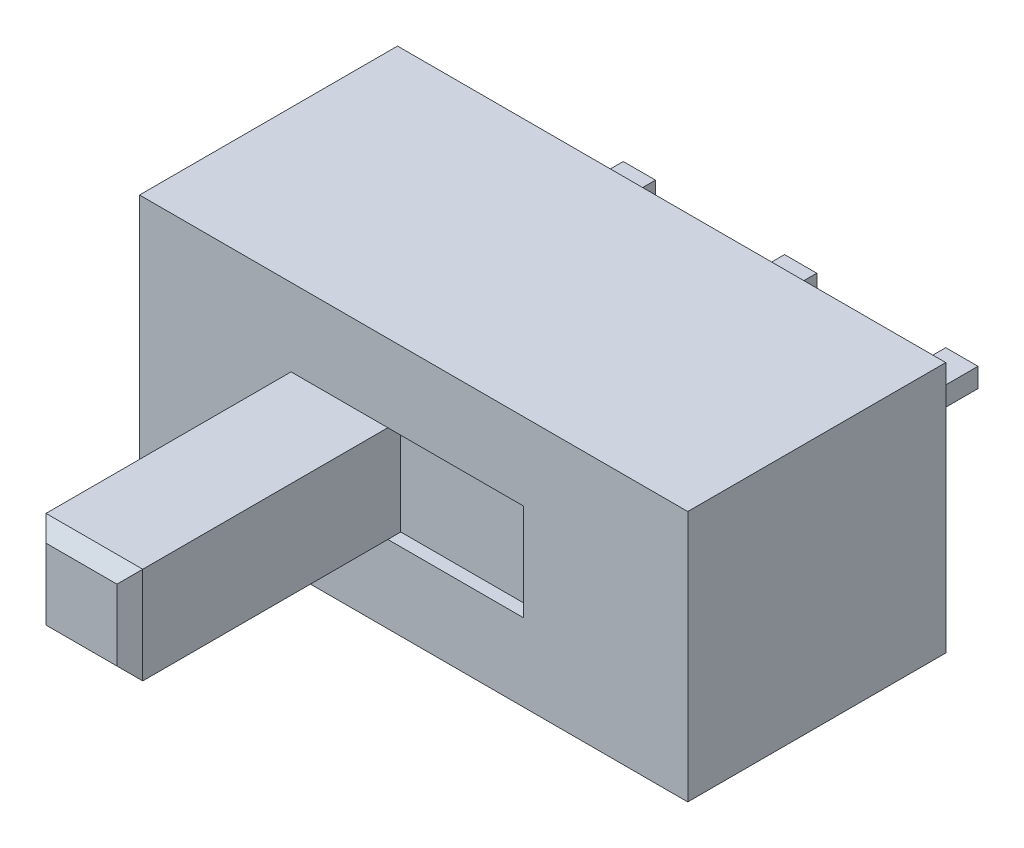
ISO-10303-21;
HEADER;
FILE_DESCRIPTION(('STEP AP214'),'2;1');
FILE_NAME('part.step','',(''),(''),'','','');
FILE_SCHEMA(('AUTOMOTIVE_DESIGN { 1 0 10303 214 1 1 1 1 }'));
ENDSEC;
DATA;
#1=APPLICATION_CONTEXT('core data for automotive mechanical design processes');
#2=APPLICATION_PROTOCOL_DEFINITION('international standard','automotive_design',2000,#1);
#3=PRODUCT_CONTEXT('',#1,'mechanical');
#4=PRODUCT('Part','Part','',(#3));
#5=PRODUCT_RELATED_PRODUCT_CATEGORY('part','',(#4));
#6=PRODUCT_DEFINITION_FORMATION('','',#4);
#7=PRODUCT_DEFINITION_CONTEXT('part definition',#1,'design');
#8=PRODUCT_DEFINITION('design','',#6,#7);
#9=PRODUCT_DEFINITION_SHAPE('','',#8);
#10=(LENGTH_UNIT() NAMED_UNIT(*) SI_UNIT(.MILLI.,.METRE.));
#11=(NAMED_UNIT(*) PLANE_ANGLE_UNIT() SI_UNIT($,.RADIAN.));
#12=(NAMED_UNIT(*) SI_UNIT($,.STERADIAN.) SOLID_ANGLE_UNIT());
#13=UNCERTAINTY_MEASURE_WITH_UNIT(LENGTH_MEASURE(1.E-05),#10,'distance_accuracy_value','');
#14=(GEOMETRIC_REPRESENTATION_CONTEXT(3) GLOBAL_UNCERTAINTY_ASSIGNED_CONTEXT((#13)) GLOBAL_UNIT_ASSIGNED_CONTEXT((#10,
#11,#12)) REPRESENTATION_CONTEXT('',''));
#15=CARTESIAN_POINT('',(0.,0.,0.));
#16=DIRECTION('',(0.,0.,1.));
#17=DIRECTION('',(1.,0.,0.));
#18=AXIS2_PLACEMENT_3D('',#15,#16,#17);
#19=CARTESIAN_POINT('',(0.,0.,0.));
#20=DIRECTION('',(0.,0.,1.));
#21=DIRECTION('',(1.,0.,0.));
#22=AXIS2_PLACEMENT_3D('',#19,#20,#21);
#23=PLANE('',#22);
#24=DIRECTION('',(0.,-1.,0.));
#25=VECTOR('',#24,1.);
#26=CARTESIAN_POINT('',(-2.25,0.15,0.));
#27=LINE('',#26,#25);
#28=CARTESIAN_POINT('',(-2.25,0.15,0.));
#29=VERTEX_POINT('',#28);
#30=CARTESIAN_POINT('',(-2.25,-0.15,0.));
#31=VERTEX_POINT('',#30);
#32=EDGE_CURVE('E224',#29,#31,#27,.T.);
#33=ORIENTED_EDGE('',*,*,#32,.F.);
#34=DIRECTION('',(1.,0.,0.));
#35=VECTOR('',#34,1.);
#36=CARTESIAN_POINT('',(-2.25,0.15,0.));
#37=LINE('',#36,#35);
#38=CARTESIAN_POINT('',(-2.75,0.15,0.));
#39=VERTEX_POINT('',#38);
#40=EDGE_CURVE('E237',#39,#29,#37,.T.);
#41=ORIENTED_EDGE('',*,*,#40,.F.);
#42=DIRECTION('',(0.,1.,0.));
#43=VECTOR('',#42,1.);
#44=CARTESIAN_POINT('',(-2.75,0.15,0.));
#45=LINE('',#44,#43);
#46=CARTESIAN_POINT('',(-2.75,-0.15,0.));
#47=VERTEX_POINT('',#46);
#48=EDGE_CURVE('E246',#47,#39,#45,.T.);
#49=ORIENTED_EDGE('',*,*,#48,.F.);
#50=DIRECTION('',(-1.,0.,0.));
#51=VECTOR('',#50,1.);
#52=CARTESIAN_POINT('',(-2.25,-0.15,0.));
#53=LINE('',#52,#51);
#54=EDGE_CURVE('E227',#31,#47,#53,.T.);
#55=ORIENTED_EDGE('',*,*,#54,.F.);
#56=EDGE_LOOP('',(#33,#41,#49,#55));
#57=FACE_BOUND('',#56,.T.);
#58=DIRECTION('',(0.,1.,0.));
#59=VECTOR('',#58,1.);
#60=CARTESIAN_POINT('',(4.25,1.95,0.));
#61=LINE('',#60,#59);
#62=CARTESIAN_POINT('',(4.25,-1.95,0.));
#63=VERTEX_POINT('',#62);
#64=CARTESIAN_POINT('',(4.25,1.95,0.));
#65=VERTEX_POINT('',#64);
#66=EDGE_CURVE('E344',#63,#65,#61,.T.);
#67=ORIENTED_EDGE('',*,*,#66,.F.);
#68=DIRECTION('',(1.,0.,0.));
#69=VECTOR('',#68,1.);
#70=CARTESIAN_POINT('',(-4.25,-1.95,0.));
#71=LINE('',#70,#69);
#72=CARTESIAN_POINT('',(-4.25,-1.95,0.));
#73=VERTEX_POINT('',#72);
#74=EDGE_CURVE('E349',#73,#63,#71,.T.);
#75=ORIENTED_EDGE('',*,*,#74,.F.);
#76=DIRECTION('',(0.,-1.,0.));
#77=VECTOR('',#76,1.);
#78=CARTESIAN_POINT('',(-4.25,1.95,0.));
#79=LINE('',#78,#77);
#80=CARTESIAN_POINT('',(-4.25,1.95,0.));
#81=VERTEX_POINT('',#80);
#82=EDGE_CURVE('E360',#81,#73,#79,.T.);
#83=ORIENTED_EDGE('',*,*,#82,.F.);
#84=DIRECTION('',(-1.,0.,0.));
#85=VECTOR('',#84,1.);
#86=CARTESIAN_POINT('',(-4.25,1.95,0.));
#87=LINE('',#86,#85);
#88=EDGE_CURVE('E358',#65,#81,#87,.T.);
#89=ORIENTED_EDGE('',*,*,#88,.F.);
#90=EDGE_LOOP('',(#67,#75,#83,#89));
#91=FACE_BOUND('',#90,.T.);
#92=DIRECTION('',(0.,1.,0.));
#93=VECTOR('',#92,1.);
#94=CARTESIAN_POINT('',(-0.25,0.15,0.));
#95=LINE('',#94,#93);
#96=CARTESIAN_POINT('',(-0.25,-0.15,0.));
#97=VERTEX_POINT('',#96);
#98=CARTESIAN_POINT('',(-0.25,0.15,0.));
#99=VERTEX_POINT('',#98);
#100=EDGE_CURVE('E262',#97,#99,#95,.T.);
#101=ORIENTED_EDGE('',*,*,#100,.F.);
#102=DIRECTION('',(-1.,0.,0.));
#103=VECTOR('',#102,1.);
#104=CARTESIAN_POINT('',(0.25,-0.15,0.));
#105=LINE('',#104,#103);
#106=CARTESIAN_POINT('',(0.25,-0.15,0.));
#107=VERTEX_POINT('',#106);
#108=EDGE_CURVE('E267',#107,#97,#105,.T.);
#109=ORIENTED_EDGE('',*,*,#108,.F.);
#110=DIRECTION('',(0.,-1.,0.));
#111=VECTOR('',#110,1.);
#112=CARTESIAN_POINT('',(0.25,0.15,0.));
#113=LINE('',#112,#111);
#114=CARTESIAN_POINT('',(0.25,0.15,0.));
#115=VERTEX_POINT('',#114);
#116=EDGE_CURVE('E279',#115,#107,#113,.T.);
#117=ORIENTED_EDGE('',*,*,#116,.F.);
#118=DIRECTION('',(1.,0.,0.));
#119=VECTOR('',#118,1.);
#120=CARTESIAN_POINT('',(0.25,0.15,0.));
#121=LINE('',#120,#119);
#122=EDGE_CURVE('E276',#99,#115,#121,.T.);
#123=ORIENTED_EDGE('',*,*,#122,.F.);
#124=EDGE_LOOP('',(#101,#109,#117,#123));
#125=FACE_BOUND('',#124,.T.);
#126=DIRECTION('',(1.,0.,0.));
#127=VECTOR('',#126,1.);
#128=CARTESIAN_POINT('',(2.25,0.15,0.));
#129=LINE('',#128,#127);
#130=CARTESIAN_POINT('',(2.25,0.15,0.));
#131=VERTEX_POINT('',#130);
#132=CARTESIAN_POINT('',(2.75,0.15,0.));
#133=VERTEX_POINT('',#132);
#134=EDGE_CURVE('E223',#131,#133,#129,.T.);
#135=ORIENTED_EDGE('',*,*,#134,.F.);
#136=DIRECTION('',(0.,1.,0.));
#137=VECTOR('',#136,1.);
#138=CARTESIAN_POINT('',(2.25,0.15,0.));
#139=LINE('',#138,#137);
#140=CARTESIAN_POINT('',(2.25,-0.15,0.));
#141=VERTEX_POINT('',#140);
#142=EDGE_CURVE('E220',#141,#131,#139,.T.);
#143=ORIENTED_EDGE('',*,*,#142,.F.);
#144=DIRECTION('',(-1.,0.,0.));
#145=VECTOR('',#144,1.);
#146=CARTESIAN_POINT('',(2.25,-0.15,0.));
#147=LINE('',#146,#145);
#148=CARTESIAN_POINT('',(2.75,-0.15,0.));
#149=VERTEX_POINT('',#148);
#150=EDGE_CURVE('E57',#149,#141,#147,.T.);
#151=ORIENTED_EDGE('',*,*,#150,.F.);
#152=DIRECTION('',(0.,-1.,0.));
#153=VECTOR('',#152,1.);
#154=CARTESIAN_POINT('',(2.75,0.15,0.));
#155=LINE('',#154,#153);
#156=EDGE_CURVE('E52',#133,#149,#155,.T.);
#157=ORIENTED_EDGE('',*,*,#156,.F.);
#158=EDGE_LOOP('',(#135,#143,#151,#157));
#159=FACE_BOUND('',#158,.T.);
#160=ADVANCED_FACE('F35',(#57,#91,#125,#159),#23,.F.);
#161=CARTESIAN_POINT('',(0.,0.,4.));
#162=DIRECTION('',(0.,0.,1.));
#163=DIRECTION('',(1.,0.,0.));
#164=AXIS2_PLACEMENT_3D('',#161,#162,#163);
#165=PLANE('',#164);
#166=DIRECTION('',(-1.,0.,0.));
#167=VECTOR('',#166,1.);
#168=CARTESIAN_POINT('',(-0.4,0.75,4.));
#169=LINE('',#168,#167);
#170=CARTESIAN_POINT('',(1.7,0.75,4.));
#171=VERTEX_POINT('',#170);
#172=CARTESIAN_POINT('',(-0.4,0.75,4.));
#173=VERTEX_POINT('',#172);
#174=EDGE_CURVE('E300',#171,#173,#169,.T.);
#175=ORIENTED_EDGE('',*,*,#174,.F.);
#176=DIRECTION('',(0.,1.,0.));
#177=VECTOR('',#176,1.);
#178=CARTESIAN_POINT('',(1.7,0.75,4.));
#179=LINE('',#178,#177);
#180=CARTESIAN_POINT('',(1.7,-0.75,4.));
#181=VERTEX_POINT('',#180);
#182=EDGE_CURVE('E312',#181,#171,#179,.T.);
#183=ORIENTED_EDGE('',*,*,#182,.F.);
#184=DIRECTION('',(1.,0.,0.));
#185=VECTOR('',#184,1.);
#186=CARTESIAN_POINT('',(-0.4,-0.75,4.));
#187=LINE('',#186,#185);
#188=CARTESIAN_POINT('',(-0.4,-0.75,4.));
#189=VERTEX_POINT('',#188);
#190=EDGE_CURVE('E295',#189,#181,#187,.T.);
#191=ORIENTED_EDGE('',*,*,#190,.F.);
#192=DIRECTION('',(1.,0.,0.));
#193=VECTOR('',#192,1.);
#194=CARTESIAN_POINT('',(-1.9,-0.75,4.));
#195=LINE('',#194,#193);
#196=CARTESIAN_POINT('',(-1.9,-0.75,4.));
#197=VERTEX_POINT('',#196);
#198=EDGE_CURVE('E331',#197,#189,#195,.T.);
#199=ORIENTED_EDGE('',*,*,#198,.F.);
#200=DIRECTION('',(0.,-1.,0.));
#201=VECTOR('',#200,1.);
#202=CARTESIAN_POINT('',(-1.9,0.75,4.));
#203=LINE('',#202,#201);
#204=CARTESIAN_POINT('',(-1.9,0.75,4.));
#205=VERTEX_POINT('',#204);
#206=EDGE_CURVE('E328',#205,#197,#203,.T.);
#207=ORIENTED_EDGE('',*,*,#206,.F.);
#208=DIRECTION('',(-1.,0.,0.));
#209=VECTOR('',#208,1.);
#210=CARTESIAN_POINT('',(-1.9,0.75,4.));
#211=LINE('',#210,#209);
#212=EDGE_CURVE('E325',#173,#205,#211,.T.);
#213=ORIENTED_EDGE('',*,*,#212,.F.);
#214=EDGE_LOOP('',(#175,#183,#191,#199,#207,#213));
#215=FACE_BOUND('',#214,.T.);
#216=DIRECTION('',(0.,1.,0.));
#217=VECTOR('',#216,1.);
#218=CARTESIAN_POINT('',(4.25,1.95,4.));
#219=LINE('',#218,#217);
#220=CARTESIAN_POINT('',(4.25,-1.95,4.));
#221=VERTEX_POINT('',#220);
#222=CARTESIAN_POINT('',(4.25,1.95,4.));
#223=VERTEX_POINT('',#222);
#224=EDGE_CURVE('E345',#221,#223,#219,.T.);
#225=ORIENTED_EDGE('',*,*,#224,.T.);
#226=DIRECTION('',(-1.,0.,0.));
#227=VECTOR('',#226,1.);
#228=CARTESIAN_POINT('',(-4.25,1.95,4.));
#229=LINE('',#228,#227);
#230=CARTESIAN_POINT('',(-4.25,1.95,4.));
#231=VERTEX_POINT('',#230);
#232=EDGE_CURVE('E348',#223,#231,#229,.T.);
#233=ORIENTED_EDGE('',*,*,#232,.T.);
#234=DIRECTION('',(0.,-1.,0.));
#235=VECTOR('',#234,1.);
#236=CARTESIAN_POINT('',(-4.25,1.95,4.));
#237=LINE('',#236,#235);
#238=CARTESIAN_POINT('',(-4.25,-1.95,4.));
#239=VERTEX_POINT('',#238);
#240=EDGE_CURVE('E351',#231,#239,#237,.T.);
#241=ORIENTED_EDGE('',*,*,#240,.T.);
#242=DIRECTION('',(1.,0.,0.));
#243=VECTOR('',#242,1.);
#244=CARTESIAN_POINT('',(-4.25,-1.95,4.));
#245=LINE('',#244,#243);
#246=EDGE_CURVE('E353',#239,#221,#245,.T.);
#247=ORIENTED_EDGE('',*,*,#246,.T.);
#248=EDGE_LOOP('',(#225,#233,#241,#247));
#249=FACE_BOUND('',#248,.T.);
#250=ADVANCED_FACE('F419',(#215,#249),#165,.T.);
#251=CARTESIAN_POINT('',(4.25,1.95,4.));
#252=DIRECTION('',(-1.,0.,0.));
#253=DIRECTION('',(0.,-1.,0.));
#254=AXIS2_PLACEMENT_3D('',#251,#252,#253);
#255=PLANE('',#254);
#256=ORIENTED_EDGE('',*,*,#66,.T.);
#257=DIRECTION('',(0.,0.,-1.));
#258=VECTOR('',#257,1.);
#259=CARTESIAN_POINT('',(4.25,1.95,4.));
#260=LINE('',#259,#258);
#261=EDGE_CURVE('E371',#223,#65,#260,.T.);
#262=ORIENTED_EDGE('',*,*,#261,.F.);
#263=ORIENTED_EDGE('',*,*,#224,.F.);
#264=DIRECTION('',(0.,0.,-1.));
#265=VECTOR('',#264,1.);
#266=CARTESIAN_POINT('',(4.25,-1.95,4.));
#267=LINE('',#266,#265);
#268=EDGE_CURVE('E355',#221,#63,#267,.T.);
#269=ORIENTED_EDGE('',*,*,#268,.T.);
#270=EDGE_LOOP('',(#256,#262,#263,#269));
#271=FACE_BOUND('',#270,.T.);
#272=ADVANCED_FACE('F452',(#271),#255,.F.);
#273=CARTESIAN_POINT('',(-4.25,1.95,4.));
#274=DIRECTION('',(0.,-1.,0.));
#275=DIRECTION('',(0.,0.,-1.));
#276=AXIS2_PLACEMENT_3D('',#273,#274,#275);
#277=PLANE('',#276);
#278=ORIENTED_EDGE('',*,*,#88,.T.);
#279=DIRECTION('',(0.,0.,-1.));
#280=VECTOR('',#279,1.);
#281=CARTESIAN_POINT('',(-4.25,1.95,4.));
#282=LINE('',#281,#280);
#283=EDGE_CURVE('E368',#231,#81,#282,.T.);
#284=ORIENTED_EDGE('',*,*,#283,.F.);
#285=ORIENTED_EDGE('',*,*,#232,.F.);
#286=ORIENTED_EDGE('',*,*,#261,.T.);
#287=EDGE_LOOP('',(#278,#284,#285,#286));
#288=FACE_BOUND('',#287,.T.);
#289=ADVANCED_FACE('F464',(#288),#277,.F.);
#290=CARTESIAN_POINT('',(-4.25,1.95,4.));
#291=DIRECTION('',(1.,0.,0.));
#292=DIRECTION('',(0.,0.,-1.));
#293=AXIS2_PLACEMENT_3D('',#290,#291,#292);
#294=PLANE('',#293);
#295=ORIENTED_EDGE('',*,*,#82,.T.);
#296=DIRECTION('',(0.,0.,-1.));
#297=VECTOR('',#296,1.);
#298=CARTESIAN_POINT('',(-4.25,-1.95,4.));
#299=LINE('',#298,#297);
#300=EDGE_CURVE('E365',#239,#73,#299,.T.);
#301=ORIENTED_EDGE('',*,*,#300,.F.);
#302=ORIENTED_EDGE('',*,*,#240,.F.);
#303=ORIENTED_EDGE('',*,*,#283,.T.);
#304=EDGE_LOOP('',(#295,#301,#302,#303));
#305=FACE_BOUND('',#304,.T.);
#306=ADVANCED_FACE('F460',(#305),#294,.F.);
#307=CARTESIAN_POINT('',(-4.25,-1.95,4.));
#308=DIRECTION('',(0.,1.,0.));
#309=DIRECTION('',(-1.,0.,0.));
#310=AXIS2_PLACEMENT_3D('',#307,#308,#309);
#311=PLANE('',#310);
#312=ORIENTED_EDGE('',*,*,#74,.T.);
#313=ORIENTED_EDGE('',*,*,#268,.F.);
#314=ORIENTED_EDGE('',*,*,#246,.F.);
#315=ORIENTED_EDGE('',*,*,#300,.T.);
#316=EDGE_LOOP('',(#312,#313,#314,#315));
#317=FACE_BOUND('',#316,.T.);
#318=ADVANCED_FACE('F457',(#317),#311,.F.);
#319=CARTESIAN_POINT('',(-0.4,0.75,8.));
#320=DIRECTION('',(-1.,0.,0.));
#321=DIRECTION('',(0.,-1.,0.));
#322=AXIS2_PLACEMENT_3D('',#319,#320,#321);
#323=PLANE('',#322);
#324=DIRECTION('',(0.,0.,-1.));
#325=VECTOR('',#324,1.);
#326=CARTESIAN_POINT('',(-0.4,0.75,8.));
#327=LINE('',#326,#325);
#328=CARTESIAN_POINT('',(-0.4,0.75,7.8));
#329=VERTEX_POINT('',#328);
#330=EDGE_CURVE('E341',#329,#173,#327,.T.);
#331=ORIENTED_EDGE('',*,*,#330,.F.);
#332=DIRECTION('',(0.,-1.,0.));
#333=VECTOR('',#332,1.);
#334=CARTESIAN_POINT('',(-0.4,-0.75,7.8));
#335=LINE('',#334,#333);
#336=CARTESIAN_POINT('',(-0.4,-0.75,7.8));
#337=VERTEX_POINT('',#336);
#338=EDGE_CURVE('E383',#329,#337,#335,.T.);
#339=ORIENTED_EDGE('',*,*,#338,.T.);
#340=DIRECTION('',(0.,0.,-1.));
#341=VECTOR('',#340,1.);
#342=CARTESIAN_POINT('',(-0.4,-0.75,8.));
#343=LINE('',#342,#341);
#344=EDGE_CURVE('E334',#337,#189,#343,.T.);
#345=ORIENTED_EDGE('',*,*,#344,.T.);
#346=DIRECTION('',(0.,0.,1.));
#347=VECTOR('',#346,1.);
#348=CARTESIAN_POINT('',(-0.4,-0.75,3.8));
#349=LINE('',#348,#347);
#350=CARTESIAN_POINT('',(-0.4,-0.75,3.8));
#351=VERTEX_POINT('',#350);
#352=EDGE_CURVE('E309',#351,#189,#349,.T.);
#353=ORIENTED_EDGE('',*,*,#352,.F.);
#354=DIRECTION('',(0.,-1.,0.));
#355=VECTOR('',#354,1.);
#356=CARTESIAN_POINT('',(-0.4,0.75,3.8));
#357=LINE('',#356,#355);
#358=CARTESIAN_POINT('',(-0.4,0.75,3.8));
#359=VERTEX_POINT('',#358);
#360=EDGE_CURVE('E296',#359,#351,#357,.T.);
#361=ORIENTED_EDGE('',*,*,#360,.F.);
#362=DIRECTION('',(0.,0.,1.));
#363=VECTOR('',#362,1.);
#364=CARTESIAN_POINT('',(-0.4,0.75,3.8));
#365=LINE('',#364,#363);
#366=EDGE_CURVE('E316',#359,#173,#365,.T.);
#367=ORIENTED_EDGE('',*,*,#366,.T.);
#368=EDGE_LOOP('',(#331,#339,#345,#353,#361,#367));
#369=FACE_BOUND('',#368,.T.);
#370=ADVANCED_FACE('F427',(#369),#323,.F.);
#371=CARTESIAN_POINT('',(-1.9,0.75,8.));
#372=DIRECTION('',(0.,-1.,0.));
#373=DIRECTION('',(0.,0.,-1.));
#374=AXIS2_PLACEMENT_3D('',#371,#372,#373);
#375=PLANE('',#374);
#376=DIRECTION('',(0.,0.,-1.));
#377=VECTOR('',#376,1.);
#378=CARTESIAN_POINT('',(-1.9,0.75,8.));
#379=LINE('',#378,#377);
#380=CARTESIAN_POINT('',(-1.9,0.75,7.8));
#381=VERTEX_POINT('',#380);
#382=EDGE_CURVE('E339',#381,#205,#379,.T.);
#383=ORIENTED_EDGE('',*,*,#382,.F.);
#384=DIRECTION('',(1.,0.,0.));
#385=VECTOR('',#384,1.);
#386=CARTESIAN_POINT('',(-0.4,0.75,7.8));
#387=LINE('',#386,#385);
#388=EDGE_CURVE('E386',#381,#329,#387,.T.);
#389=ORIENTED_EDGE('',*,*,#388,.T.);
#390=ORIENTED_EDGE('',*,*,#330,.T.);
#391=ORIENTED_EDGE('',*,*,#212,.T.);
#392=EDGE_LOOP('',(#383,#389,#390,#391));
#393=FACE_BOUND('',#392,.T.);
#394=ADVANCED_FACE('F412',(#393),#375,.F.);
#395=CARTESIAN_POINT('',(-1.9,0.75,8.));
#396=DIRECTION('',(1.,0.,0.));
#397=DIRECTION('',(0.,1.,0.));
#398=AXIS2_PLACEMENT_3D('',#395,#396,#397);
#399=PLANE('',#398);
#400=DIRECTION('',(0.,0.,-1.));
#401=VECTOR('',#400,1.);
#402=CARTESIAN_POINT('',(-1.9,-0.75,8.));
#403=LINE('',#402,#401);
#404=CARTESIAN_POINT('',(-1.9,-0.75,7.8));
#405=VERTEX_POINT('',#404);
#406=EDGE_CURVE('E337',#405,#197,#403,.T.);
#407=ORIENTED_EDGE('',*,*,#406,.F.);
#408=DIRECTION('',(0.,1.,0.));
#409=VECTOR('',#408,1.);
#410=CARTESIAN_POINT('',(-1.9,0.75,7.8));
#411=LINE('',#410,#409);
#412=EDGE_CURVE('E44',#405,#381,#411,.T.);
#413=ORIENTED_EDGE('',*,*,#412,.T.);
#414=ORIENTED_EDGE('',*,*,#382,.T.);
#415=ORIENTED_EDGE('',*,*,#206,.T.);
#416=EDGE_LOOP('',(#407,#413,#414,#415));
#417=FACE_BOUND('',#416,.T.);
#418=ADVANCED_FACE('F410',(#417),#399,.F.);
#419=CARTESIAN_POINT('',(-1.9,-0.75,8.));
#420=DIRECTION('',(0.,1.,0.));
#421=DIRECTION('',(0.,0.,1.));
#422=AXIS2_PLACEMENT_3D('',#419,#420,#421);
#423=PLANE('',#422);
#424=ORIENTED_EDGE('',*,*,#344,.F.);
#425=DIRECTION('',(-1.,0.,0.));
#426=VECTOR('',#425,1.);
#427=CARTESIAN_POINT('',(-1.9,-0.75,7.8));
#428=LINE('',#427,#426);
#429=EDGE_CURVE('E11',#337,#405,#428,.T.);
#430=ORIENTED_EDGE('',*,*,#429,.T.);
#431=ORIENTED_EDGE('',*,*,#406,.T.);
#432=ORIENTED_EDGE('',*,*,#198,.T.);
#433=EDGE_LOOP('',(#424,#430,#431,#432));
#434=FACE_BOUND('',#433,.T.);
#435=ADVANCED_FACE('F425',(#434),#423,.F.);
#436=CARTESIAN_POINT('',(0.,0.,8.));
#437=DIRECTION('',(0.,0.,1.));
#438=DIRECTION('',(1.,0.,0.));
#439=AXIS2_PLACEMENT_3D('',#436,#437,#438);
#440=PLANE('',#439);
#441=DIRECTION('',(1.,0.,0.));
#442=VECTOR('',#441,1.);
#443=CARTESIAN_POINT('',(-0.4,-0.55,8.));
#444=LINE('',#443,#442);
#445=CARTESIAN_POINT('',(-1.7,-0.55,8.));
#446=VERTEX_POINT('',#445);
#447=CARTESIAN_POINT('',(-0.6,-0.55,8.));
#448=VERTEX_POINT('',#447);
#449=EDGE_CURVE('E374',#446,#448,#444,.T.);
#450=ORIENTED_EDGE('',*,*,#449,.T.);
#451=DIRECTION('',(0.,1.,0.));
#452=VECTOR('',#451,1.);
#453=CARTESIAN_POINT('',(-0.600000000000001,0.75,8.));
#454=LINE('',#453,#452);
#455=CARTESIAN_POINT('',(-0.600000000000001,0.549999999999999,8.));
#456=VERTEX_POINT('',#455);
#457=EDGE_CURVE('E380',#448,#456,#454,.T.);
#458=ORIENTED_EDGE('',*,*,#457,.T.);
#459=DIRECTION('',(-1.,0.,0.));
#460=VECTOR('',#459,1.);
#461=CARTESIAN_POINT('',(-1.9,0.549999999999999,8.));
#462=LINE('',#461,#460);
#463=CARTESIAN_POINT('',(-1.7,0.549999999999999,8.));
#464=VERTEX_POINT('',#463);
#465=EDGE_CURVE('E378',#456,#464,#462,.T.);
#466=ORIENTED_EDGE('',*,*,#465,.T.);
#467=DIRECTION('',(0.,-1.,0.));
#468=VECTOR('',#467,1.);
#469=CARTESIAN_POINT('',(-1.7,-0.75,8.));
#470=LINE('',#469,#468);
#471=EDGE_CURVE('E376',#464,#446,#470,.T.);
#472=ORIENTED_EDGE('',*,*,#471,.T.);
#473=EDGE_LOOP('',(#450,#458,#466,#472));
#474=FACE_BOUND('',#473,.T.);
#475=ADVANCED_FACE('F437',(#474),#440,.T.);
#476=CARTESIAN_POINT('',(-1.7,0.,8.));
#477=DIRECTION('',(-0.707106781186549,0.,0.707106781186546));
#478=DIRECTION('',(0.,1.,0.));
#479=AXIS2_PLACEMENT_3D('',#476,#477,#478);
#480=PLANE('',#479);
#481=DIRECTION('',(-0.577350269189625,0.577350269189625,-0.577350269189627));
#482=VECTOR('',#481,1.);
#483=CARTESIAN_POINT('',(-1.51666666666667,0.366666666666667,8.18333333333333));
#484=LINE('',#483,#482);
#485=EDGE_CURVE('E391',#381,#464,#484,.F.);
#486=ORIENTED_EDGE('',*,*,#485,.F.);
#487=ORIENTED_EDGE('',*,*,#412,.F.);
#488=DIRECTION('',(-0.577350269189625,-0.577350269189625,-0.577350269189627));
#489=VECTOR('',#488,1.);
#490=CARTESIAN_POINT('',(-1.13333333333333,0.0166666666666652,8.56666666666667));
#491=LINE('',#490,#489);
#492=EDGE_CURVE('E39',#446,#405,#491,.T.);
#493=ORIENTED_EDGE('',*,*,#492,.F.);
#494=ORIENTED_EDGE('',*,*,#471,.F.);
#495=EDGE_LOOP('',(#486,#487,#493,#494));
#496=FACE_BOUND('',#495,.T.);
#497=ADVANCED_FACE('F37',(#496),#480,.T.);
#498=CARTESIAN_POINT('',(0.,-0.55,8.));
#499=DIRECTION('',(0.,-0.707106781186549,0.707106781186546));
#500=DIRECTION('',(-1.,0.,0.));
#501=AXIS2_PLACEMENT_3D('',#498,#499,#500);
#502=PLANE('',#501);
#503=ORIENTED_EDGE('',*,*,#492,.T.);
#504=ORIENTED_EDGE('',*,*,#429,.F.);
#505=DIRECTION('',(-0.577350269189625,0.577350269189625,0.577350269189627));
#506=VECTOR('',#505,1.);
#507=CARTESIAN_POINT('',(-0.400000000000001,-0.749999999999999,7.8));
#508=LINE('',#507,#506);
#509=EDGE_CURVE('E390',#448,#337,#508,.F.);
#510=ORIENTED_EDGE('',*,*,#509,.F.);
#511=ORIENTED_EDGE('',*,*,#449,.F.);
#512=EDGE_LOOP('',(#503,#504,#510,#511));
#513=FACE_BOUND('',#512,.T.);
#514=ADVANCED_FACE('F402',(#513),#502,.T.);
#515=CARTESIAN_POINT('',(0.,0.549999999999999,8.));
#516=DIRECTION('',(0.,0.707106781186549,0.707106781186546));
#517=DIRECTION('',(1.,0.,0.));
#518=AXIS2_PLACEMENT_3D('',#515,#516,#517);
#519=PLANE('',#518);
#520=ORIENTED_EDGE('',*,*,#485,.T.);
#521=ORIENTED_EDGE('',*,*,#465,.F.);
#522=DIRECTION('',(0.577350269189625,0.577350269189625,-0.577350269189627));
#523=VECTOR('',#522,1.);
#524=CARTESIAN_POINT('',(-0.400000000000001,0.749999999999999,7.8));
#525=LINE('',#524,#523);
#526=EDGE_CURVE('E319',#329,#456,#525,.F.);
#527=ORIENTED_EDGE('',*,*,#526,.F.);
#528=ORIENTED_EDGE('',*,*,#388,.F.);
#529=EDGE_LOOP('',(#520,#521,#527,#528));
#530=FACE_BOUND('',#529,.T.);
#531=ADVANCED_FACE('F435',(#530),#519,.T.);
#532=CARTESIAN_POINT('',(-0.6,0.,8.));
#533=DIRECTION('',(0.707106781186549,0.,0.707106781186546));
#534=DIRECTION('',(0.,-1.,0.));
#535=AXIS2_PLACEMENT_3D('',#532,#533,#534);
#536=PLANE('',#535);
#537=ORIENTED_EDGE('',*,*,#509,.T.);
#538=ORIENTED_EDGE('',*,*,#338,.F.);
#539=ORIENTED_EDGE('',*,*,#526,.T.);
#540=ORIENTED_EDGE('',*,*,#457,.F.);
#541=EDGE_LOOP('',(#537,#538,#539,#540));
#542=FACE_BOUND('',#541,.T.);
#543=ADVANCED_FACE('F433',(#542),#536,.T.);
#544=CARTESIAN_POINT('',(-0.4,0.75,3.8));
#545=DIRECTION('',(0.,1.,0.));
#546=DIRECTION('',(-1.,0.,0.));
#547=AXIS2_PLACEMENT_3D('',#544,#545,#546);
#548=PLANE('',#547);
#549=ORIENTED_EDGE('',*,*,#174,.T.);
#550=ORIENTED_EDGE('',*,*,#366,.F.);
#551=DIRECTION('',(-1.,0.,0.));
#552=VECTOR('',#551,1.);
#553=CARTESIAN_POINT('',(-0.4,0.75,3.8));
#554=LINE('',#553,#552);
#555=CARTESIAN_POINT('',(1.7,0.75,3.8));
#556=VERTEX_POINT('',#555);
#557=EDGE_CURVE('E306',#556,#359,#554,.T.);
#558=ORIENTED_EDGE('',*,*,#557,.F.);
#559=DIRECTION('',(0.,0.,1.));
#560=VECTOR('',#559,1.);
#561=CARTESIAN_POINT('',(1.7,0.75,3.8));
#562=LINE('',#561,#560);
#563=EDGE_CURVE('E320',#556,#171,#562,.T.);
#564=ORIENTED_EDGE('',*,*,#563,.T.);
#565=EDGE_LOOP('',(#549,#550,#558,#564));
#566=FACE_BOUND('',#565,.T.);
#567=ADVANCED_FACE('F474',(#566),#548,.F.);
#568=CARTESIAN_POINT('',(1.7,0.75,3.8));
#569=DIRECTION('',(1.,0.,0.));
#570=DIRECTION('',(0.,1.,0.));
#571=AXIS2_PLACEMENT_3D('',#568,#569,#570);
#572=PLANE('',#571);
#573=ORIENTED_EDGE('',*,*,#182,.T.);
#574=ORIENTED_EDGE('',*,*,#563,.F.);
#575=DIRECTION('',(0.,1.,0.));
#576=VECTOR('',#575,1.);
#577=CARTESIAN_POINT('',(1.7,0.75,3.8));
#578=LINE('',#577,#576);
#579=CARTESIAN_POINT('',(1.7,-0.75,3.8));
#580=VERTEX_POINT('',#579);
#581=EDGE_CURVE('E303',#580,#556,#578,.T.);
#582=ORIENTED_EDGE('',*,*,#581,.F.);
#583=DIRECTION('',(0.,0.,1.));
#584=VECTOR('',#583,1.);
#585=CARTESIAN_POINT('',(1.7,-0.75,3.8));
#586=LINE('',#585,#584);
#587=EDGE_CURVE('E322',#580,#181,#586,.T.);
#588=ORIENTED_EDGE('',*,*,#587,.T.);
#589=EDGE_LOOP('',(#573,#574,#582,#588));
#590=FACE_BOUND('',#589,.T.);
#591=ADVANCED_FACE('F496',(#590),#572,.F.);
#592=CARTESIAN_POINT('',(-0.4,-0.75,3.8));
#593=DIRECTION('',(0.,-1.,0.));
#594=DIRECTION('',(1.,0.,0.));
#595=AXIS2_PLACEMENT_3D('',#592,#593,#594);
#596=PLANE('',#595);
#597=ORIENTED_EDGE('',*,*,#190,.T.);
#598=ORIENTED_EDGE('',*,*,#587,.F.);
#599=DIRECTION('',(1.,0.,0.));
#600=VECTOR('',#599,1.);
#601=CARTESIAN_POINT('',(-0.4,-0.75,3.8));
#602=LINE('',#601,#600);
#603=EDGE_CURVE('E299',#351,#580,#602,.T.);
#604=ORIENTED_EDGE('',*,*,#603,.F.);
#605=ORIENTED_EDGE('',*,*,#352,.T.);
#606=EDGE_LOOP('',(#597,#598,#604,#605));
#607=FACE_BOUND('',#606,.T.);
#608=ADVANCED_FACE('F505',(#607),#596,.F.);
#609=CARTESIAN_POINT('',(0.,0.,3.8));
#610=DIRECTION('',(0.,0.,1.));
#611=DIRECTION('',(1.,0.,0.));
#612=AXIS2_PLACEMENT_3D('',#609,#610,#611);
#613=PLANE('',#612);
#614=ORIENTED_EDGE('',*,*,#360,.T.);
#615=ORIENTED_EDGE('',*,*,#603,.T.);
#616=ORIENTED_EDGE('',*,*,#581,.T.);
#617=ORIENTED_EDGE('',*,*,#557,.T.);
#618=EDGE_LOOP('',(#614,#615,#616,#617));
#619=FACE_BOUND('',#618,.T.);
#620=ADVANCED_FACE('F513',(#619),#613,.T.);
#621=CARTESIAN_POINT('',(-0.25,0.15,-2.));
#622=DIRECTION('',(1.,0.,0.));
#623=DIRECTION('',(0.,0.,-1.));
#624=AXIS2_PLACEMENT_3D('',#621,#622,#623);
#625=PLANE('',#624);
#626=ORIENTED_EDGE('',*,*,#100,.T.);
#627=DIRECTION('',(0.,0.,1.));
#628=VECTOR('',#627,1.);
#629=CARTESIAN_POINT('',(-0.25,0.15,-2.));
#630=LINE('',#629,#628);
#631=CARTESIAN_POINT('',(-0.25,0.15,-2.));
#632=VERTEX_POINT('',#631);
#633=EDGE_CURVE('E292',#632,#99,#630,.T.);
#634=ORIENTED_EDGE('',*,*,#633,.F.);
#635=DIRECTION('',(0.,1.,0.));
#636=VECTOR('',#635,1.);
#637=CARTESIAN_POINT('',(-0.25,0.15,-2.));
#638=LINE('',#637,#636);
#639=CARTESIAN_POINT('',(-0.25,-0.15,-2.));
#640=VERTEX_POINT('',#639);
#641=EDGE_CURVE('E263',#640,#632,#638,.T.);
#642=ORIENTED_EDGE('',*,*,#641,.F.);
#643=DIRECTION('',(0.,0.,1.));
#644=VECTOR('',#643,1.);
#645=CARTESIAN_POINT('',(-0.25,-0.15,-2.));
#646=LINE('',#645,#644);
#647=EDGE_CURVE('E273',#640,#97,#646,.T.);
#648=ORIENTED_EDGE('',*,*,#647,.T.);
#649=EDGE_LOOP('',(#626,#634,#642,#648));
#650=FACE_BOUND('',#649,.T.);
#651=ADVANCED_FACE('F520',(#650),#625,.F.);
#652=CARTESIAN_POINT('',(0.25,0.15,-2.));
#653=DIRECTION('',(0.,-1.,0.));
#654=DIRECTION('',(1.,0.,0.));
#655=AXIS2_PLACEMENT_3D('',#652,#653,#654);
#656=PLANE('',#655);
#657=ORIENTED_EDGE('',*,*,#122,.T.);
#658=DIRECTION('',(0.,0.,1.));
#659=VECTOR('',#658,1.);
#660=CARTESIAN_POINT('',(0.25,0.15,-2.));
#661=LINE('',#660,#659);
#662=CARTESIAN_POINT('',(0.25,0.15,-2.));
#663=VERTEX_POINT('',#662);
#664=EDGE_CURVE('E289',#663,#115,#661,.T.);
#665=ORIENTED_EDGE('',*,*,#664,.F.);
#666=DIRECTION('',(1.,0.,0.));
#667=VECTOR('',#666,1.);
#668=CARTESIAN_POINT('',(0.25,0.15,-2.));
#669=LINE('',#668,#667);
#670=EDGE_CURVE('E266',#632,#663,#669,.T.);
#671=ORIENTED_EDGE('',*,*,#670,.F.);
#672=ORIENTED_EDGE('',*,*,#633,.T.);
#673=EDGE_LOOP('',(#657,#665,#671,#672));
#674=FACE_BOUND('',#673,.T.);
#675=ADVANCED_FACE('F529',(#674),#656,.F.);
#676=CARTESIAN_POINT('',(0.25,0.15,-2.));
#677=DIRECTION('',(-1.,0.,0.));
#678=DIRECTION('',(0.,-1.,0.));
#679=AXIS2_PLACEMENT_3D('',#676,#677,#678);
#680=PLANE('',#679);
#681=ORIENTED_EDGE('',*,*,#116,.T.);
#682=DIRECTION('',(0.,0.,1.));
#683=VECTOR('',#682,1.);
#684=CARTESIAN_POINT('',(0.25,-0.15,-2.));
#685=LINE('',#684,#683);
#686=CARTESIAN_POINT('',(0.25,-0.15,-2.));
#687=VERTEX_POINT('',#686);
#688=EDGE_CURVE('E286',#687,#107,#685,.T.);
#689=ORIENTED_EDGE('',*,*,#688,.F.);
#690=DIRECTION('',(0.,-1.,0.));
#691=VECTOR('',#690,1.);
#692=CARTESIAN_POINT('',(0.25,0.15,-2.));
#693=LINE('',#692,#691);
#694=EDGE_CURVE('E269',#663,#687,#693,.T.);
#695=ORIENTED_EDGE('',*,*,#694,.F.);
#696=ORIENTED_EDGE('',*,*,#664,.T.);
#697=EDGE_LOOP('',(#681,#689,#695,#696));
#698=FACE_BOUND('',#697,.T.);
#699=ADVANCED_FACE('F537',(#698),#680,.F.);
#700=CARTESIAN_POINT('',(0.25,-0.15,-2.));
#701=DIRECTION('',(0.,1.,0.));
#702=DIRECTION('',(-1.,0.,0.));
#703=AXIS2_PLACEMENT_3D('',#700,#701,#702);
#704=PLANE('',#703);
#705=ORIENTED_EDGE('',*,*,#108,.T.);
#706=ORIENTED_EDGE('',*,*,#647,.F.);
#707=DIRECTION('',(-1.,0.,0.));
#708=VECTOR('',#707,1.);
#709=CARTESIAN_POINT('',(0.25,-0.15,-2.));
#710=LINE('',#709,#708);
#711=EDGE_CURVE('E271',#687,#640,#710,.T.);
#712=ORIENTED_EDGE('',*,*,#711,.F.);
#713=ORIENTED_EDGE('',*,*,#688,.T.);
#714=EDGE_LOOP('',(#705,#706,#712,#713));
#715=FACE_BOUND('',#714,.T.);
#716=ADVANCED_FACE('F545',(#715),#704,.F.);
#717=CARTESIAN_POINT('',(0.,0.,-2.));
#718=DIRECTION('',(0.,0.,-1.));
#719=DIRECTION('',(-1.,0.,0.));
#720=AXIS2_PLACEMENT_3D('',#717,#718,#719);
#721=PLANE('',#720);
#722=ORIENTED_EDGE('',*,*,#641,.T.);
#723=ORIENTED_EDGE('',*,*,#670,.T.);
#724=ORIENTED_EDGE('',*,*,#694,.T.);
#725=ORIENTED_EDGE('',*,*,#711,.T.);
#726=EDGE_LOOP('',(#722,#723,#724,#725));
#727=FACE_BOUND('',#726,.T.);
#728=ADVANCED_FACE('F553',(#727),#721,.T.);
#729=CARTESIAN_POINT('',(-2.25,0.15,-2.));
#730=DIRECTION('',(-1.,0.,0.));
#731=DIRECTION('',(0.,0.,1.));
#732=AXIS2_PLACEMENT_3D('',#729,#730,#731);
#733=PLANE('',#732);
#734=ORIENTED_EDGE('',*,*,#32,.T.);
#735=DIRECTION('',(0.,0.,1.));
#736=VECTOR('',#735,1.);
#737=CARTESIAN_POINT('',(-2.25,-0.15,-2.));
#738=LINE('',#737,#736);
#739=CARTESIAN_POINT('',(-2.25,-0.15,-2.));
#740=VERTEX_POINT('',#739);
#741=EDGE_CURVE('E259',#740,#31,#738,.T.);
#742=ORIENTED_EDGE('',*,*,#741,.F.);
#743=DIRECTION('',(0.,-1.,0.));
#744=VECTOR('',#743,1.);
#745=CARTESIAN_POINT('',(-2.25,0.15,-2.));
#746=LINE('',#745,#744);
#747=CARTESIAN_POINT('',(-2.25,0.15,-2.));
#748=VERTEX_POINT('',#747);
#749=EDGE_CURVE('E233',#748,#740,#746,.T.);
#750=ORIENTED_EDGE('',*,*,#749,.F.);
#751=DIRECTION('',(0.,0.,1.));
#752=VECTOR('',#751,1.);
#753=CARTESIAN_POINT('',(-2.25,0.15,-2.));
#754=LINE('',#753,#752);
#755=EDGE_CURVE('E242',#748,#29,#754,.T.);
#756=ORIENTED_EDGE('',*,*,#755,.T.);
#757=EDGE_LOOP('',(#734,#742,#750,#756));
#758=FACE_BOUND('',#757,.T.);
#759=ADVANCED_FACE('F561',(#758),#733,.F.);
#760=CARTESIAN_POINT('',(-2.25,-0.15,-2.));
#761=DIRECTION('',(0.,1.,0.));
#762=DIRECTION('',(-1.,0.,0.));
#763=AXIS2_PLACEMENT_3D('',#760,#761,#762);
#764=PLANE('',#763);
#765=ORIENTED_EDGE('',*,*,#54,.T.);
#766=DIRECTION('',(0.,0.,1.));
#767=VECTOR('',#766,1.);
#768=CARTESIAN_POINT('',(-2.75,-0.15,-2.));
#769=LINE('',#768,#767);
#770=CARTESIAN_POINT('',(-2.75,-0.15,-2.));
#771=VERTEX_POINT('',#770);
#772=EDGE_CURVE('E256',#771,#47,#769,.T.);
#773=ORIENTED_EDGE('',*,*,#772,.F.);
#774=DIRECTION('',(-1.,0.,0.));
#775=VECTOR('',#774,1.);
#776=CARTESIAN_POINT('',(-2.25,-0.15,-2.));
#777=LINE('',#776,#775);
#778=EDGE_CURVE('E236',#740,#771,#777,.T.);
#779=ORIENTED_EDGE('',*,*,#778,.F.);
#780=ORIENTED_EDGE('',*,*,#741,.T.);
#781=EDGE_LOOP('',(#765,#773,#779,#780));
#782=FACE_BOUND('',#781,.T.);
#783=ADVANCED_FACE('F569',(#782),#764,.F.);
#784=CARTESIAN_POINT('',(-2.75,0.15,-2.));
#785=DIRECTION('',(1.,0.,0.));
#786=DIRECTION('',(0.,0.,-1.));
#787=AXIS2_PLACEMENT_3D('',#784,#785,#786);
#788=PLANE('',#787);
#789=ORIENTED_EDGE('',*,*,#48,.T.);
#790=DIRECTION('',(0.,0.,1.));
#791=VECTOR('',#790,1.);
#792=CARTESIAN_POINT('',(-2.75,0.15,-2.));
#793=LINE('',#792,#791);
#794=CARTESIAN_POINT('',(-2.75,0.15,-2.));
#795=VERTEX_POINT('',#794);
#796=EDGE_CURVE('E253',#795,#39,#793,.T.);
#797=ORIENTED_EDGE('',*,*,#796,.F.);
#798=DIRECTION('',(0.,1.,0.));
#799=VECTOR('',#798,1.);
#800=CARTESIAN_POINT('',(-2.75,0.15,-2.));
#801=LINE('',#800,#799);
#802=EDGE_CURVE('E239',#771,#795,#801,.T.);
#803=ORIENTED_EDGE('',*,*,#802,.F.);
#804=ORIENTED_EDGE('',*,*,#772,.T.);
#805=EDGE_LOOP('',(#789,#797,#803,#804));
#806=FACE_BOUND('',#805,.T.);
#807=ADVANCED_FACE('F577',(#806),#788,.F.);
#808=CARTESIAN_POINT('',(-2.25,0.15,-2.));
#809=DIRECTION('',(0.,-1.,0.));
#810=DIRECTION('',(1.,0.,0.));
#811=AXIS2_PLACEMENT_3D('',#808,#809,#810);
#812=PLANE('',#811);
#813=ORIENTED_EDGE('',*,*,#40,.T.);
#814=ORIENTED_EDGE('',*,*,#755,.F.);
#815=DIRECTION('',(1.,0.,0.));
#816=VECTOR('',#815,1.);
#817=CARTESIAN_POINT('',(-2.25,0.15,-2.));
#818=LINE('',#817,#816);
#819=EDGE_CURVE('E241',#795,#748,#818,.T.);
#820=ORIENTED_EDGE('',*,*,#819,.F.);
#821=ORIENTED_EDGE('',*,*,#796,.T.);
#822=EDGE_LOOP('',(#813,#814,#820,#821));
#823=FACE_BOUND('',#822,.T.);
#824=ADVANCED_FACE('F585',(#823),#812,.F.);
#825=CARTESIAN_POINT('',(0.,0.,-2.));
#826=DIRECTION('',(0.,0.,-1.));
#827=DIRECTION('',(-1.,0.,0.));
#828=AXIS2_PLACEMENT_3D('',#825,#826,#827);
#829=PLANE('',#828);
#830=ORIENTED_EDGE('',*,*,#749,.T.);
#831=ORIENTED_EDGE('',*,*,#778,.T.);
#832=ORIENTED_EDGE('',*,*,#802,.T.);
#833=ORIENTED_EDGE('',*,*,#819,.T.);
#834=EDGE_LOOP('',(#830,#831,#832,#833));
#835=FACE_BOUND('',#834,.T.);
#836=ADVANCED_FACE('F593',(#835),#829,.T.);
#837=CARTESIAN_POINT('',(2.25,0.15,-2.));
#838=DIRECTION('',(0.,-1.,0.));
#839=DIRECTION('',(1.,0.,0.));
#840=AXIS2_PLACEMENT_3D('',#837,#838,#839);
#841=PLANE('',#840);
#842=ORIENTED_EDGE('',*,*,#134,.T.);
#843=DIRECTION('',(0.,0.,1.));
#844=VECTOR('',#843,1.);
#845=CARTESIAN_POINT('',(2.75,0.15,-2.));
#846=LINE('',#845,#844);
#847=CARTESIAN_POINT('',(2.75,0.15,-2.));
#848=VERTEX_POINT('',#847);
#849=EDGE_CURVE('E204',#848,#133,#846,.T.);
#850=ORIENTED_EDGE('',*,*,#849,.F.);
#851=DIRECTION('',(1.,0.,0.));
#852=VECTOR('',#851,1.);
#853=CARTESIAN_POINT('',(2.25,0.15,-2.));
#854=LINE('',#853,#852);
#855=CARTESIAN_POINT('',(2.25,0.15,-2.));
#856=VERTEX_POINT('',#855);
#857=EDGE_CURVE('E211',#856,#848,#854,.T.);
#858=ORIENTED_EDGE('',*,*,#857,.F.);
#859=DIRECTION('',(0.,0.,1.));
#860=VECTOR('',#859,1.);
#861=CARTESIAN_POINT('',(2.25,0.15,-2.));
#862=LINE('',#861,#860);
#863=EDGE_CURVE('E757',#856,#131,#862,.T.);
#864=ORIENTED_EDGE('',*,*,#863,.T.);
#865=EDGE_LOOP('',(#842,#850,#858,#864));
#866=FACE_BOUND('',#865,.T.);
#867=ADVANCED_FACE('F222',(#866),#841,.F.);
#868=CARTESIAN_POINT('',(2.75,0.15,-2.));
#869=DIRECTION('',(-1.,0.,0.));
#870=DIRECTION('',(0.,0.,1.));
#871=AXIS2_PLACEMENT_3D('',#868,#869,#870);
#872=PLANE('',#871);
#873=ORIENTED_EDGE('',*,*,#156,.T.);
#874=DIRECTION('',(0.,0.,1.));
#875=VECTOR('',#874,1.);
#876=CARTESIAN_POINT('',(2.75,-0.15,-2.));
#877=LINE('',#876,#875);
#878=CARTESIAN_POINT('',(2.75,-0.15,-2.));
#879=VERTEX_POINT('',#878);
#880=EDGE_CURVE('E207',#879,#149,#877,.T.);
#881=ORIENTED_EDGE('',*,*,#880,.F.);
#882=DIRECTION('',(0.,-1.,0.));
#883=VECTOR('',#882,1.);
#884=CARTESIAN_POINT('',(2.75,0.15,-2.));
#885=LINE('',#884,#883);
#886=EDGE_CURVE('E200',#848,#879,#885,.T.);
#887=ORIENTED_EDGE('',*,*,#886,.F.);
#888=ORIENTED_EDGE('',*,*,#849,.T.);
#889=EDGE_LOOP('',(#873,#881,#887,#888));
#890=FACE_BOUND('',#889,.T.);
#891=ADVANCED_FACE('F202',(#890),#872,.F.);
#892=CARTESIAN_POINT('',(2.25,-0.15,-2.));
#893=DIRECTION('',(0.,1.,0.));
#894=DIRECTION('',(-1.,0.,0.));
#895=AXIS2_PLACEMENT_3D('',#892,#893,#894);
#896=PLANE('',#895);
#897=ORIENTED_EDGE('',*,*,#150,.T.);
#898=DIRECTION('',(0.,0.,1.));
#899=VECTOR('',#898,1.);
#900=CARTESIAN_POINT('',(2.25,-0.15,-2.));
#901=LINE('',#900,#899);
#902=CARTESIAN_POINT('',(2.25,-0.15,-2.));
#903=VERTEX_POINT('',#902);
#904=EDGE_CURVE('E229',#903,#141,#901,.T.);
#905=ORIENTED_EDGE('',*,*,#904,.F.);
#906=DIRECTION('',(-1.,0.,0.));
#907=VECTOR('',#906,1.);
#908=CARTESIAN_POINT('',(2.25,-0.15,-2.));
#909=LINE('',#908,#907);
#910=EDGE_CURVE('E210',#879,#903,#909,.T.);
#911=ORIENTED_EDGE('',*,*,#910,.F.);
#912=ORIENTED_EDGE('',*,*,#880,.T.);
#913=EDGE_LOOP('',(#897,#905,#911,#912));
#914=FACE_BOUND('',#913,.T.);
#915=ADVANCED_FACE('F614',(#914),#896,.F.);
#916=CARTESIAN_POINT('',(2.25,0.15,-2.));
#917=DIRECTION('',(1.,0.,0.));
#918=DIRECTION('',(0.,0.,-1.));
#919=AXIS2_PLACEMENT_3D('',#916,#917,#918);
#920=PLANE('',#919);
#921=ORIENTED_EDGE('',*,*,#142,.T.);
#922=ORIENTED_EDGE('',*,*,#863,.F.);
#923=DIRECTION('',(0.,1.,0.));
#924=VECTOR('',#923,1.);
#925=CARTESIAN_POINT('',(2.25,0.15,-2.));
#926=LINE('',#925,#924);
#927=EDGE_CURVE('E216',#903,#856,#926,.T.);
#928=ORIENTED_EDGE('',*,*,#927,.F.);
#929=ORIENTED_EDGE('',*,*,#904,.T.);
#930=EDGE_LOOP('',(#921,#922,#928,#929));
#931=FACE_BOUND('',#930,.T.);
#932=ADVANCED_FACE('F621',(#931),#920,.F.);
#933=CARTESIAN_POINT('',(0.,0.,-2.));
#934=DIRECTION('',(0.,0.,-1.));
#935=DIRECTION('',(-1.,0.,0.));
#936=AXIS2_PLACEMENT_3D('',#933,#934,#935);
#937=PLANE('',#936);
#938=ORIENTED_EDGE('',*,*,#857,.T.);
#939=ORIENTED_EDGE('',*,*,#886,.T.);
#940=ORIENTED_EDGE('',*,*,#910,.T.);
#941=ORIENTED_EDGE('',*,*,#927,.T.);
#942=EDGE_LOOP('',(#938,#939,#940,#941));
#943=FACE_BOUND('',#942,.T.);
#944=ADVANCED_FACE('F214',(#943),#937,.T.);
#945=CLOSED_SHELL('',(#160,#250,#272,#289,#306,#318,#370,#394,#418,#435,#475,#497,#514,#531,
#543,#567,#591,#608,#620,#651,#675,#699,#716,#728,#759,#783,#807,#824,#836,#867,#891,#915,#932,#944));
#946=MANIFOLD_SOLID_BREP('B2',#945);
#947=ADVANCED_BREP_SHAPE_REPRESENTATION('',(#18,#946),#14);
#948=SHAPE_DEFINITION_REPRESENTATION(#9,#947);
ENDSEC;
END-ISO-10303-21;
